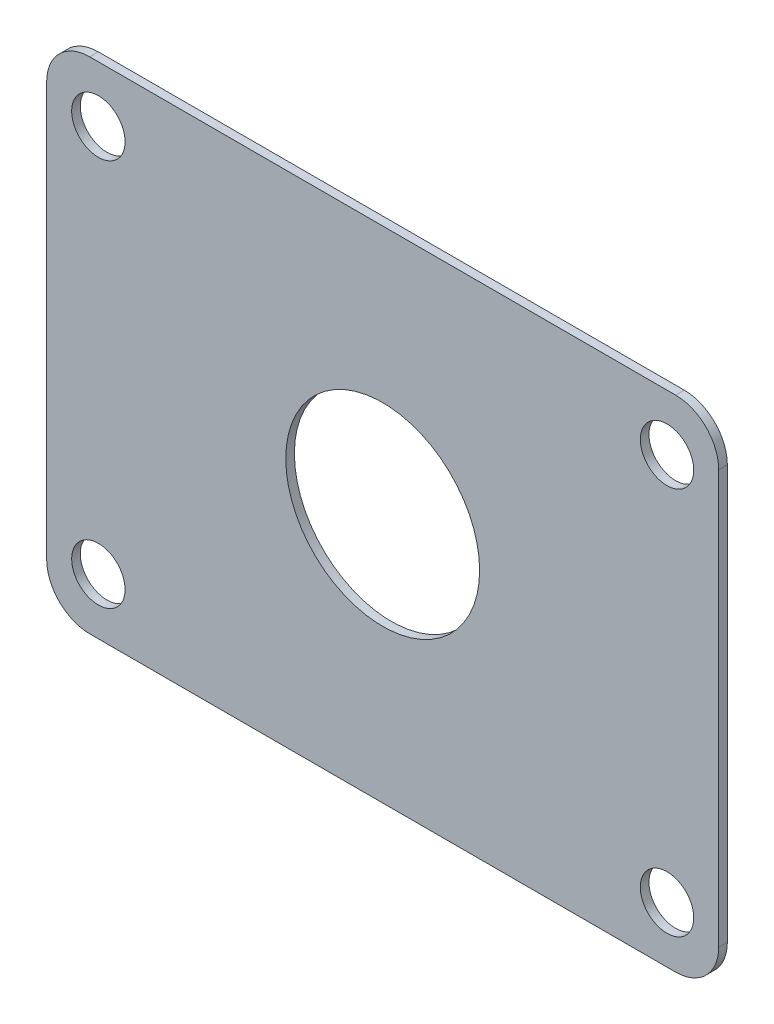
ISO-10303-21;
HEADER;
FILE_DESCRIPTION(('STEP AP214'),'2;1');
FILE_NAME('part.step','',(''),(''),'','','');
FILE_SCHEMA(('AUTOMOTIVE_DESIGN { 1 0 10303 214 1 1 1 1 }'));
ENDSEC;
DATA;
#1=APPLICATION_CONTEXT('core data for automotive mechanical design processes');
#2=APPLICATION_PROTOCOL_DEFINITION('international standard','automotive_design',2000,#1);
#3=PRODUCT_CONTEXT('',#1,'mechanical');
#4=PRODUCT('Part','Part','',(#3));
#5=PRODUCT_RELATED_PRODUCT_CATEGORY('part','',(#4));
#6=PRODUCT_DEFINITION_FORMATION('','',#4);
#7=PRODUCT_DEFINITION_CONTEXT('part definition',#1,'design');
#8=PRODUCT_DEFINITION('design','',#6,#7);
#9=PRODUCT_DEFINITION_SHAPE('','',#8);
#10=(LENGTH_UNIT() NAMED_UNIT(*) SI_UNIT(.MILLI.,.METRE.));
#11=(NAMED_UNIT(*) PLANE_ANGLE_UNIT() SI_UNIT($,.RADIAN.));
#12=(NAMED_UNIT(*) SI_UNIT($,.STERADIAN.) SOLID_ANGLE_UNIT());
#13=UNCERTAINTY_MEASURE_WITH_UNIT(LENGTH_MEASURE(1.E-05),#10,'distance_accuracy_value','');
#14=(GEOMETRIC_REPRESENTATION_CONTEXT(3) GLOBAL_UNCERTAINTY_ASSIGNED_CONTEXT((#13)) GLOBAL_UNIT_ASSIGNED_CONTEXT((#10,
#11,#12)) REPRESENTATION_CONTEXT('',''));
#15=CARTESIAN_POINT('',(0.,0.,0.));
#16=DIRECTION('',(0.,0.,1.));
#17=DIRECTION('',(1.,0.,0.));
#18=AXIS2_PLACEMENT_3D('',#15,#16,#17);
#19=CARTESIAN_POINT('',(-39.,29.,1.));
#20=DIRECTION('',(1.,0.,0.));
#21=DIRECTION('',(0.,0.,-1.));
#22=AXIS2_PLACEMENT_3D('',#19,#20,#21);
#23=PLANE('',#22);
#24=DIRECTION('',(0.,-1.,0.));
#25=VECTOR('',#24,1.);
#26=CARTESIAN_POINT('',(-39.,29.,0.));
#27=LINE('',#26,#25);
#28=CARTESIAN_POINT('',(-39.,24.,0.));
#29=VERTEX_POINT('',#28);
#30=CARTESIAN_POINT('',(-39.,-24.,0.));
#31=VERTEX_POINT('',#30);
#32=EDGE_CURVE('E141',#29,#31,#27,.T.);
#33=ORIENTED_EDGE('',*,*,#32,.T.);
#34=DIRECTION('',(0.,0.,-1.));
#35=VECTOR('',#34,1.);
#36=CARTESIAN_POINT('',(-39.,-24.,1.));
#37=LINE('',#36,#35);
#38=CARTESIAN_POINT('',(-39.,-24.,1.));
#39=VERTEX_POINT('',#38);
#40=EDGE_CURVE('E119',#31,#39,#37,.F.);
#41=ORIENTED_EDGE('',*,*,#40,.T.);
#42=DIRECTION('',(0.,-1.,0.));
#43=VECTOR('',#42,1.);
#44=CARTESIAN_POINT('',(-39.,29.,1.));
#45=LINE('',#44,#43);
#46=CARTESIAN_POINT('',(-39.,24.,1.));
#47=VERTEX_POINT('',#46);
#48=EDGE_CURVE('E150',#47,#39,#45,.T.);
#49=ORIENTED_EDGE('',*,*,#48,.F.);
#50=DIRECTION('',(0.,0.,-1.));
#51=VECTOR('',#50,1.);
#52=CARTESIAN_POINT('',(-39.,24.,1.));
#53=LINE('',#52,#51);
#54=EDGE_CURVE('E124',#47,#29,#53,.T.);
#55=ORIENTED_EDGE('',*,*,#54,.T.);
#56=EDGE_LOOP('',(#33,#41,#49,#55));
#57=FACE_BOUND('',#56,.T.);
#58=ADVANCED_FACE('F48',(#57),#23,.F.);
#59=CARTESIAN_POINT('',(39.,-29.,1.));
#60=DIRECTION('',(0.,1.,0.));
#61=DIRECTION('',(-1.,0.,0.));
#62=AXIS2_PLACEMENT_3D('',#59,#60,#61);
#63=PLANE('',#62);
#64=DIRECTION('',(1.,0.,0.));
#65=VECTOR('',#64,1.);
#66=CARTESIAN_POINT('',(39.,-29.,1.));
#67=LINE('',#66,#65);
#68=CARTESIAN_POINT('',(-34.,-29.,1.));
#69=VERTEX_POINT('',#68);
#70=CARTESIAN_POINT('',(34.,-29.,1.));
#71=VERTEX_POINT('',#70);
#72=EDGE_CURVE('E134',#69,#71,#67,.T.);
#73=ORIENTED_EDGE('',*,*,#72,.F.);
#74=DIRECTION('',(0.,0.,-1.));
#75=VECTOR('',#74,1.);
#76=CARTESIAN_POINT('',(-34.,-29.,1.));
#77=LINE('',#76,#75);
#78=CARTESIAN_POINT('',(-34.,-29.,0.));
#79=VERTEX_POINT('',#78);
#80=EDGE_CURVE('E118',#69,#79,#77,.T.);
#81=ORIENTED_EDGE('',*,*,#80,.T.);
#82=DIRECTION('',(1.,0.,0.));
#83=VECTOR('',#82,1.);
#84=CARTESIAN_POINT('',(39.,-29.,0.));
#85=LINE('',#84,#83);
#86=CARTESIAN_POINT('',(34.,-29.,0.));
#87=VERTEX_POINT('',#86);
#88=EDGE_CURVE('E131',#79,#87,#85,.T.);
#89=ORIENTED_EDGE('',*,*,#88,.T.);
#90=DIRECTION('',(0.,0.,-1.));
#91=VECTOR('',#90,1.);
#92=CARTESIAN_POINT('',(34.,-29.,1.));
#93=LINE('',#92,#91);
#94=EDGE_CURVE('E136',#87,#71,#93,.F.);
#95=ORIENTED_EDGE('',*,*,#94,.T.);
#96=EDGE_LOOP('',(#73,#81,#89,#95));
#97=FACE_BOUND('',#96,.T.);
#98=ADVANCED_FACE('F130',(#97),#63,.F.);
#99=CARTESIAN_POINT('',(39.,29.,1.));
#100=DIRECTION('',(-1.,0.,0.));
#101=DIRECTION('',(0.,-1.,0.));
#102=AXIS2_PLACEMENT_3D('',#99,#100,#101);
#103=PLANE('',#102);
#104=DIRECTION('',(0.,1.,0.));
#105=VECTOR('',#104,1.);
#106=CARTESIAN_POINT('',(39.,29.,1.));
#107=LINE('',#106,#105);
#108=CARTESIAN_POINT('',(39.,-24.,1.));
#109=VERTEX_POINT('',#108);
#110=CARTESIAN_POINT('',(39.,24.,1.));
#111=VERTEX_POINT('',#110);
#112=EDGE_CURVE('E195',#109,#111,#107,.T.);
#113=ORIENTED_EDGE('',*,*,#112,.F.);
#114=DIRECTION('',(0.,0.,-1.));
#115=VECTOR('',#114,1.);
#116=CARTESIAN_POINT('',(39.,-24.,1.));
#117=LINE('',#116,#115);
#118=CARTESIAN_POINT('',(39.,-24.,0.));
#119=VERTEX_POINT('',#118);
#120=EDGE_CURVE('E188',#109,#119,#117,.T.);
#121=ORIENTED_EDGE('',*,*,#120,.T.);
#122=DIRECTION('',(0.,1.,0.));
#123=VECTOR('',#122,1.);
#124=CARTESIAN_POINT('',(39.,29.,0.));
#125=LINE('',#124,#123);
#126=CARTESIAN_POINT('',(39.,24.,0.));
#127=VERTEX_POINT('',#126);
#128=EDGE_CURVE('E140',#119,#127,#125,.T.);
#129=ORIENTED_EDGE('',*,*,#128,.T.);
#130=DIRECTION('',(0.,0.,-1.));
#131=VECTOR('',#130,1.);
#132=CARTESIAN_POINT('',(39.,24.,1.));
#133=LINE('',#132,#131);
#134=EDGE_CURVE('E186',#127,#111,#133,.F.);
#135=ORIENTED_EDGE('',*,*,#134,.T.);
#136=EDGE_LOOP('',(#113,#121,#129,#135));
#137=FACE_BOUND('',#136,.T.);
#138=ADVANCED_FACE('F193',(#137),#103,.F.);
#139=CARTESIAN_POINT('',(39.,29.,1.));
#140=DIRECTION('',(0.,-1.,0.));
#141=DIRECTION('',(1.,0.,0.));
#142=AXIS2_PLACEMENT_3D('',#139,#140,#141);
#143=PLANE('',#142);
#144=DIRECTION('',(-1.,0.,0.));
#145=VECTOR('',#144,1.);
#146=CARTESIAN_POINT('',(39.,29.,1.));
#147=LINE('',#146,#145);
#148=CARTESIAN_POINT('',(34.,29.,1.));
#149=VERTEX_POINT('',#148);
#150=CARTESIAN_POINT('',(-34.,29.,1.));
#151=VERTEX_POINT('',#150);
#152=EDGE_CURVE('E166',#149,#151,#147,.T.);
#153=ORIENTED_EDGE('',*,*,#152,.F.);
#154=DIRECTION('',(0.,0.,-1.));
#155=VECTOR('',#154,1.);
#156=CARTESIAN_POINT('',(34.,29.,1.));
#157=LINE('',#156,#155);
#158=CARTESIAN_POINT('',(34.,29.,0.));
#159=VERTEX_POINT('',#158);
#160=EDGE_CURVE('E12',#149,#159,#157,.T.);
#161=ORIENTED_EDGE('',*,*,#160,.T.);
#162=DIRECTION('',(-1.,0.,0.));
#163=VECTOR('',#162,1.);
#164=CARTESIAN_POINT('',(39.,29.,0.));
#165=LINE('',#164,#163);
#166=CARTESIAN_POINT('',(-34.,29.,0.));
#167=VERTEX_POINT('',#166);
#168=EDGE_CURVE('E144',#159,#167,#165,.T.);
#169=ORIENTED_EDGE('',*,*,#168,.T.);
#170=DIRECTION('',(0.,0.,-1.));
#171=VECTOR('',#170,1.);
#172=CARTESIAN_POINT('',(-34.,29.,1.));
#173=LINE('',#172,#171);
#174=EDGE_CURVE('E56',#167,#151,#173,.F.);
#175=ORIENTED_EDGE('',*,*,#174,.T.);
#176=EDGE_LOOP('',(#153,#161,#169,#175));
#177=FACE_BOUND('',#176,.T.);
#178=ADVANCED_FACE('F202',(#177),#143,.F.);
#179=CARTESIAN_POINT('',(0.,0.,1.));
#180=DIRECTION('',(0.,0.,-1.));
#181=DIRECTION('',(-1.,0.,0.));
#182=AXIS2_PLACEMENT_3D('',#179,#180,#181);
#183=PLANE('',#182);
#184=CARTESIAN_POINT('',(0.,0.,1.));
#185=DIRECTION('',(0.,0.,1.));
#186=DIRECTION('',(1.,0.,0.));
#187=AXIS2_PLACEMENT_3D('',#184,#185,#186);
#188=CIRCLE('',#187,11.25);
#189=CARTESIAN_POINT('',(11.25,0.,1.));
#190=VERTEX_POINT('',#189);
#191=EDGE_CURVE('E225',#190,#190,#188,.T.);
#192=ORIENTED_EDGE('',*,*,#191,.F.);
#193=EDGE_LOOP('',(#192));
#194=FACE_BOUND('',#193,.T.);
#195=CARTESIAN_POINT('',(-33.,-22.5,1.));
#196=DIRECTION('',(0.,0.,1.));
#197=DIRECTION('',(-1.,0.,0.));
#198=AXIS2_PLACEMENT_3D('',#195,#196,#197);
#199=CIRCLE('',#198,3.09999999999999);
#200=CARTESIAN_POINT('',(-36.1,-22.5,1.));
#201=VERTEX_POINT('',#200);
#202=EDGE_CURVE('E230',#201,#201,#199,.T.);
#203=ORIENTED_EDGE('',*,*,#202,.F.);
#204=EDGE_LOOP('',(#203));
#205=FACE_BOUND('',#204,.T.);
#206=CARTESIAN_POINT('',(33.,-22.5,1.));
#207=DIRECTION('',(0.,0.,1.));
#208=DIRECTION('',(1.,0.,0.));
#209=AXIS2_PLACEMENT_3D('',#206,#207,#208);
#210=CIRCLE('',#209,3.09999999999993);
#211=CARTESIAN_POINT('',(36.1,-22.5,1.));
#212=VERTEX_POINT('',#211);
#213=EDGE_CURVE('E237',#212,#212,#210,.T.);
#214=ORIENTED_EDGE('',*,*,#213,.F.);
#215=EDGE_LOOP('',(#214));
#216=FACE_BOUND('',#215,.T.);
#217=CARTESIAN_POINT('',(33.,22.5,1.));
#218=DIRECTION('',(0.,0.,1.));
#219=DIRECTION('',(-1.,0.,0.));
#220=AXIS2_PLACEMENT_3D('',#217,#218,#219);
#221=CIRCLE('',#220,3.09999999999993);
#222=CARTESIAN_POINT('',(29.9000000000001,22.5,1.));
#223=VERTEX_POINT('',#222);
#224=EDGE_CURVE('E224',#223,#223,#221,.T.);
#225=ORIENTED_EDGE('',*,*,#224,.F.);
#226=EDGE_LOOP('',(#225));
#227=FACE_BOUND('',#226,.T.);
#228=CARTESIAN_POINT('',(-33.,22.5,1.));
#229=DIRECTION('',(0.,0.,1.));
#230=DIRECTION('',(1.,0.,0.));
#231=AXIS2_PLACEMENT_3D('',#228,#229,#230);
#232=CIRCLE('',#231,3.09999999999999);
#233=CARTESIAN_POINT('',(-29.9,22.5,1.));
#234=VERTEX_POINT('',#233);
#235=EDGE_CURVE('E155',#234,#234,#232,.T.);
#236=ORIENTED_EDGE('',*,*,#235,.F.);
#237=EDGE_LOOP('',(#236));
#238=FACE_BOUND('',#237,.T.);
#239=ORIENTED_EDGE('',*,*,#48,.T.);
#240=CARTESIAN_POINT('',(-34.,-24.,1.));
#241=DIRECTION('',(0.,0.,-1.));
#242=DIRECTION('',(-1.,0.,0.));
#243=AXIS2_PLACEMENT_3D('',#240,#241,#242);
#244=CIRCLE('',#243,5.);
#245=EDGE_CURVE('E183',#39,#69,#244,.F.);
#246=ORIENTED_EDGE('',*,*,#245,.T.);
#247=ORIENTED_EDGE('',*,*,#72,.T.);
#248=CARTESIAN_POINT('',(34.,-24.,1.));
#249=DIRECTION('',(0.,0.,-1.));
#250=DIRECTION('',(-1.,0.,0.));
#251=AXIS2_PLACEMENT_3D('',#248,#249,#250);
#252=CIRCLE('',#251,5.);
#253=EDGE_CURVE('E180',#71,#109,#252,.F.);
#254=ORIENTED_EDGE('',*,*,#253,.T.);
#255=ORIENTED_EDGE('',*,*,#112,.T.);
#256=CARTESIAN_POINT('',(34.,24.,1.));
#257=DIRECTION('',(0.,0.,-1.));
#258=DIRECTION('',(-1.,0.,0.));
#259=AXIS2_PLACEMENT_3D('',#256,#257,#258);
#260=CIRCLE('',#259,5.);
#261=EDGE_CURVE('E69',#111,#149,#260,.F.);
#262=ORIENTED_EDGE('',*,*,#261,.T.);
#263=ORIENTED_EDGE('',*,*,#152,.T.);
#264=CARTESIAN_POINT('',(-34.,24.,1.));
#265=DIRECTION('',(0.,0.,-1.));
#266=DIRECTION('',(-1.,0.,0.));
#267=AXIS2_PLACEMENT_3D('',#264,#265,#266);
#268=CIRCLE('',#267,5.);
#269=EDGE_CURVE('E175',#151,#47,#268,.F.);
#270=ORIENTED_EDGE('',*,*,#269,.T.);
#271=EDGE_LOOP('',(#239,#246,#247,#254,#255,#262,#263,#270));
#272=FACE_BOUND('',#271,.T.);
#273=ADVANCED_FACE('F248',(#194,#205,#216,#227,#238,#272),#183,.F.);
#274=CARTESIAN_POINT('',(0.,0.,0.));
#275=DIRECTION('',(0.,0.,-1.));
#276=DIRECTION('',(-1.,0.,0.));
#277=AXIS2_PLACEMENT_3D('',#274,#275,#276);
#278=PLANE('',#277);
#279=CARTESIAN_POINT('',(0.,0.,0.));
#280=DIRECTION('',(0.,0.,-1.));
#281=DIRECTION('',(-1.,0.,0.));
#282=AXIS2_PLACEMENT_3D('',#279,#280,#281);
#283=CIRCLE('',#282,11.25);
#284=CARTESIAN_POINT('',(-11.25,0.,0.));
#285=VERTEX_POINT('',#284);
#286=EDGE_CURVE('E146',#285,#285,#283,.T.);
#287=ORIENTED_EDGE('',*,*,#286,.F.);
#288=EDGE_LOOP('',(#287));
#289=FACE_BOUND('',#288,.T.);
#290=CARTESIAN_POINT('',(-33.,-22.5,0.));
#291=DIRECTION('',(0.,0.,-1.));
#292=DIRECTION('',(-1.,0.,0.));
#293=AXIS2_PLACEMENT_3D('',#290,#291,#292);
#294=CIRCLE('',#293,3.09999999999999);
#295=CARTESIAN_POINT('',(-36.1,-22.5,0.));
#296=VERTEX_POINT('',#295);
#297=EDGE_CURVE('E161',#296,#296,#294,.T.);
#298=ORIENTED_EDGE('',*,*,#297,.F.);
#299=EDGE_LOOP('',(#298));
#300=FACE_BOUND('',#299,.T.);
#301=CARTESIAN_POINT('',(33.,-22.5,0.));
#302=DIRECTION('',(0.,0.,-1.));
#303=DIRECTION('',(-1.,0.,0.));
#304=AXIS2_PLACEMENT_3D('',#301,#302,#303);
#305=CIRCLE('',#304,3.09999999999993);
#306=CARTESIAN_POINT('',(29.9000000000001,-22.5,0.));
#307=VERTEX_POINT('',#306);
#308=EDGE_CURVE('E158',#307,#307,#305,.T.);
#309=ORIENTED_EDGE('',*,*,#308,.F.);
#310=EDGE_LOOP('',(#309));
#311=FACE_BOUND('',#310,.T.);
#312=CARTESIAN_POINT('',(33.,22.5,0.));
#313=DIRECTION('',(0.,0.,-1.));
#314=DIRECTION('',(-1.,0.,0.));
#315=AXIS2_PLACEMENT_3D('',#312,#313,#314);
#316=CIRCLE('',#315,3.09999999999993);
#317=CARTESIAN_POINT('',(29.9000000000001,22.5,0.));
#318=VERTEX_POINT('',#317);
#319=EDGE_CURVE('E154',#318,#318,#316,.T.);
#320=ORIENTED_EDGE('',*,*,#319,.F.);
#321=EDGE_LOOP('',(#320));
#322=FACE_BOUND('',#321,.T.);
#323=CARTESIAN_POINT('',(-33.,22.5,0.));
#324=DIRECTION('',(0.,0.,-1.));
#325=DIRECTION('',(-1.,0.,0.));
#326=AXIS2_PLACEMENT_3D('',#323,#324,#325);
#327=CIRCLE('',#326,3.09999999999999);
#328=CARTESIAN_POINT('',(-36.1,22.5,0.));
#329=VERTEX_POINT('',#328);
#330=EDGE_CURVE('E151',#329,#329,#327,.T.);
#331=ORIENTED_EDGE('',*,*,#330,.F.);
#332=EDGE_LOOP('',(#331));
#333=FACE_BOUND('',#332,.T.);
#334=ORIENTED_EDGE('',*,*,#88,.F.);
#335=CARTESIAN_POINT('',(-34.,-24.,0.));
#336=DIRECTION('',(0.,0.,-1.));
#337=DIRECTION('',(-1.,0.,0.));
#338=AXIS2_PLACEMENT_3D('',#335,#336,#337);
#339=CIRCLE('',#338,5.);
#340=EDGE_CURVE('E114',#79,#31,#339,.T.);
#341=ORIENTED_EDGE('',*,*,#340,.T.);
#342=ORIENTED_EDGE('',*,*,#32,.F.);
#343=CARTESIAN_POINT('',(-34.,24.,0.));
#344=DIRECTION('',(0.,0.,-1.));
#345=DIRECTION('',(-1.,0.,0.));
#346=AXIS2_PLACEMENT_3D('',#343,#344,#345);
#347=CIRCLE('',#346,5.);
#348=EDGE_CURVE('E135',#29,#167,#347,.T.);
#349=ORIENTED_EDGE('',*,*,#348,.T.);
#350=ORIENTED_EDGE('',*,*,#168,.F.);
#351=CARTESIAN_POINT('',(34.,24.,0.));
#352=DIRECTION('',(0.,0.,-1.));
#353=DIRECTION('',(-1.,0.,0.));
#354=AXIS2_PLACEMENT_3D('',#351,#352,#353);
#355=CIRCLE('',#354,5.);
#356=EDGE_CURVE('E169',#159,#127,#355,.T.);
#357=ORIENTED_EDGE('',*,*,#356,.T.);
#358=ORIENTED_EDGE('',*,*,#128,.F.);
#359=CARTESIAN_POINT('',(34.,-24.,0.));
#360=DIRECTION('',(0.,0.,-1.));
#361=DIRECTION('',(-1.,0.,0.));
#362=AXIS2_PLACEMENT_3D('',#359,#360,#361);
#363=CIRCLE('',#362,5.);
#364=EDGE_CURVE('E125',#119,#87,#363,.T.);
#365=ORIENTED_EDGE('',*,*,#364,.T.);
#366=EDGE_LOOP('',(#334,#341,#342,#349,#350,#357,#358,#365));
#367=FACE_BOUND('',#366,.T.);
#368=ADVANCED_FACE('F138',(#289,#300,#311,#322,#333,#367),#278,.T.);
#369=CARTESIAN_POINT('',(-33.,22.5,-9.));
#370=DIRECTION('',(0.,0.,1.));
#371=DIRECTION('',(1.,0.,0.));
#372=AXIS2_PLACEMENT_3D('',#369,#370,#371);
#373=CYLINDRICAL_SURFACE('',#372,3.09999999999999);
#374=ORIENTED_EDGE('',*,*,#330,.T.);
#375=EDGE_LOOP('',(#374));
#376=FACE_BOUND('',#375,.T.);
#377=ORIENTED_EDGE('',*,*,#235,.T.);
#378=EDGE_LOOP('',(#377));
#379=FACE_BOUND('',#378,.T.);
#380=ADVANCED_FACE('F330',(#376,#379),#373,.F.);
#381=CARTESIAN_POINT('',(33.,22.5,-9.));
#382=DIRECTION('',(0.,0.,1.));
#383=DIRECTION('',(1.,0.,0.));
#384=AXIS2_PLACEMENT_3D('',#381,#382,#383);
#385=CYLINDRICAL_SURFACE('',#384,3.09999999999993);
#386=ORIENTED_EDGE('',*,*,#319,.T.);
#387=EDGE_LOOP('',(#386));
#388=FACE_BOUND('',#387,.T.);
#389=ORIENTED_EDGE('',*,*,#224,.T.);
#390=EDGE_LOOP('',(#389));
#391=FACE_BOUND('',#390,.T.);
#392=ADVANCED_FACE('F246',(#388,#391),#385,.F.);
#393=CARTESIAN_POINT('',(33.,-22.5,-9.));
#394=DIRECTION('',(0.,0.,1.));
#395=DIRECTION('',(1.,0.,0.));
#396=AXIS2_PLACEMENT_3D('',#393,#394,#395);
#397=CYLINDRICAL_SURFACE('',#396,3.09999999999993);
#398=ORIENTED_EDGE('',*,*,#308,.T.);
#399=EDGE_LOOP('',(#398));
#400=FACE_BOUND('',#399,.T.);
#401=ORIENTED_EDGE('',*,*,#213,.T.);
#402=EDGE_LOOP('',(#401));
#403=FACE_BOUND('',#402,.T.);
#404=ADVANCED_FACE('F313',(#400,#403),#397,.F.);
#405=CARTESIAN_POINT('',(-33.,-22.5,-9.));
#406=DIRECTION('',(0.,0.,1.));
#407=DIRECTION('',(1.,0.,0.));
#408=AXIS2_PLACEMENT_3D('',#405,#406,#407);
#409=CYLINDRICAL_SURFACE('',#408,3.09999999999999);
#410=ORIENTED_EDGE('',*,*,#297,.T.);
#411=EDGE_LOOP('',(#410));
#412=FACE_BOUND('',#411,.T.);
#413=ORIENTED_EDGE('',*,*,#202,.T.);
#414=EDGE_LOOP('',(#413));
#415=FACE_BOUND('',#414,.T.);
#416=ADVANCED_FACE('F304',(#412,#415),#409,.F.);
#417=CARTESIAN_POINT('',(0.,0.,-9.));
#418=DIRECTION('',(0.,0.,1.));
#419=DIRECTION('',(1.,0.,0.));
#420=AXIS2_PLACEMENT_3D('',#417,#418,#419);
#421=CYLINDRICAL_SURFACE('',#420,11.25);
#422=ORIENTED_EDGE('',*,*,#286,.T.);
#423=EDGE_LOOP('',(#422));
#424=FACE_BOUND('',#423,.T.);
#425=ORIENTED_EDGE('',*,*,#191,.T.);
#426=EDGE_LOOP('',(#425));
#427=FACE_BOUND('',#426,.T.);
#428=ADVANCED_FACE('F274',(#424,#427),#421,.F.);
#429=CARTESIAN_POINT('',(-34.,-24.,1.));
#430=DIRECTION('',(0.,0.,-1.));
#431=DIRECTION('',(-1.,0.,0.));
#432=AXIS2_PLACEMENT_3D('',#429,#430,#431);
#433=CYLINDRICAL_SURFACE('',#432,5.);
#434=ORIENTED_EDGE('',*,*,#245,.F.);
#435=ORIENTED_EDGE('',*,*,#40,.F.);
#436=ORIENTED_EDGE('',*,*,#340,.F.);
#437=ORIENTED_EDGE('',*,*,#80,.F.);
#438=EDGE_LOOP('',(#434,#435,#436,#437));
#439=FACE_BOUND('',#438,.T.);
#440=ADVANCED_FACE('F117',(#439),#433,.T.);
#441=CARTESIAN_POINT('',(34.,-24.,1.));
#442=DIRECTION('',(0.,0.,-1.));
#443=DIRECTION('',(-1.,0.,0.));
#444=AXIS2_PLACEMENT_3D('',#441,#442,#443);
#445=CYLINDRICAL_SURFACE('',#444,5.);
#446=ORIENTED_EDGE('',*,*,#253,.F.);
#447=ORIENTED_EDGE('',*,*,#94,.F.);
#448=ORIENTED_EDGE('',*,*,#364,.F.);
#449=ORIENTED_EDGE('',*,*,#120,.F.);
#450=EDGE_LOOP('',(#446,#447,#448,#449));
#451=FACE_BOUND('',#450,.T.);
#452=ADVANCED_FACE('F262',(#451),#445,.T.);
#453=CARTESIAN_POINT('',(34.,24.,1.));
#454=DIRECTION('',(0.,0.,-1.));
#455=DIRECTION('',(-1.,0.,0.));
#456=AXIS2_PLACEMENT_3D('',#453,#454,#455);
#457=CYLINDRICAL_SURFACE('',#456,5.);
#458=ORIENTED_EDGE('',*,*,#261,.F.);
#459=ORIENTED_EDGE('',*,*,#134,.F.);
#460=ORIENTED_EDGE('',*,*,#356,.F.);
#461=ORIENTED_EDGE('',*,*,#160,.F.);
#462=EDGE_LOOP('',(#458,#459,#460,#461));
#463=FACE_BOUND('',#462,.T.);
#464=ADVANCED_FACE('F201',(#463),#457,.T.);
#465=CARTESIAN_POINT('',(-34.,24.,1.));
#466=DIRECTION('',(0.,0.,-1.));
#467=DIRECTION('',(-1.,0.,0.));
#468=AXIS2_PLACEMENT_3D('',#465,#466,#467);
#469=CYLINDRICAL_SURFACE('',#468,5.);
#470=ORIENTED_EDGE('',*,*,#269,.F.);
#471=ORIENTED_EDGE('',*,*,#174,.F.);
#472=ORIENTED_EDGE('',*,*,#348,.F.);
#473=ORIENTED_EDGE('',*,*,#54,.F.);
#474=EDGE_LOOP('',(#470,#471,#472,#473));
#475=FACE_BOUND('',#474,.T.);
#476=ADVANCED_FACE('F50',(#475),#469,.T.);
#477=CLOSED_SHELL('',(#58,#98,#138,#178,#273,#368,#380,#392,#404,#416,#428,#440,#452,#464,#476));
#478=MANIFOLD_SOLID_BREP('B2',#477);
#479=ADVANCED_BREP_SHAPE_REPRESENTATION('',(#18,#478),#14);
#480=SHAPE_DEFINITION_REPRESENTATION(#9,#479);
ENDSEC;
END-ISO-10303-21;
